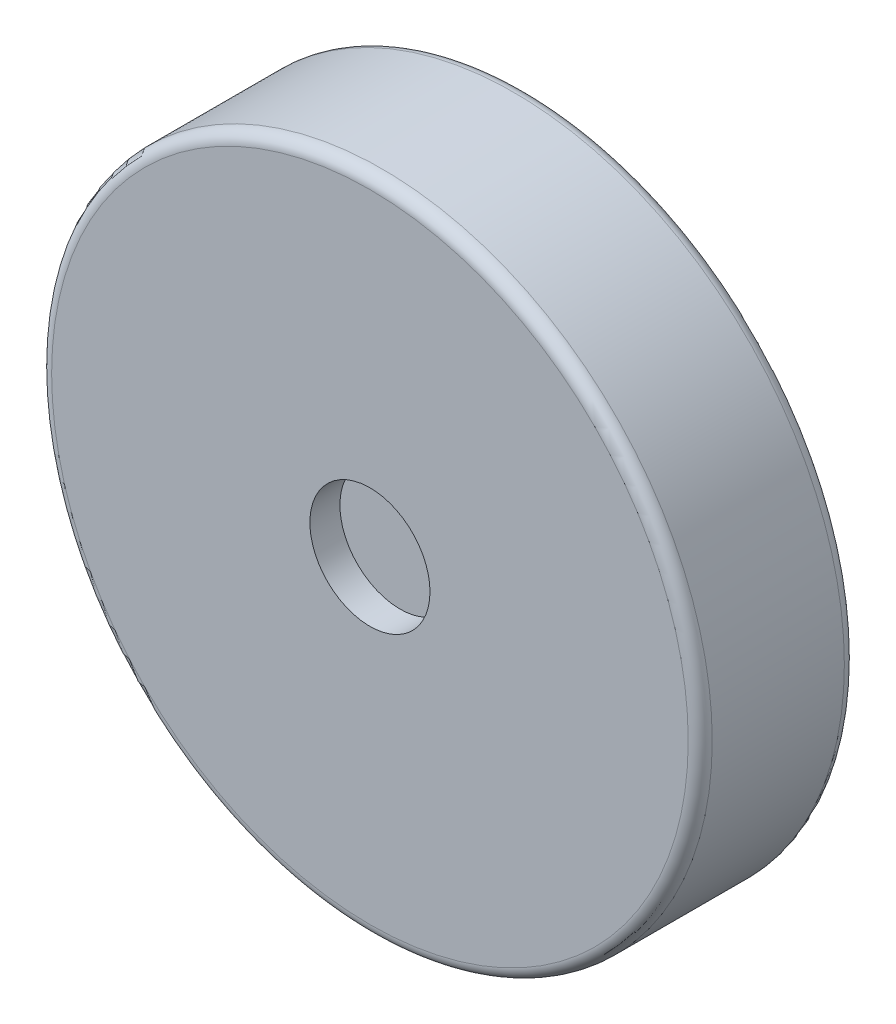
ISO-10303-21;
HEADER;
FILE_DESCRIPTION(('STEP AP214'),'2;1');
FILE_NAME('part.step','',(''),(''),'','','');
FILE_SCHEMA(('AUTOMOTIVE_DESIGN { 1 0 10303 214 1 1 1 1 }'));
ENDSEC;
DATA;
#1=APPLICATION_CONTEXT('core data for automotive mechanical design processes');
#2=APPLICATION_PROTOCOL_DEFINITION('international standard','automotive_design',2000,#1);
#3=PRODUCT_CONTEXT('',#1,'mechanical');
#4=PRODUCT('Part','Part','',(#3));
#5=PRODUCT_RELATED_PRODUCT_CATEGORY('part','',(#4));
#6=PRODUCT_DEFINITION_FORMATION('','',#4);
#7=PRODUCT_DEFINITION_CONTEXT('part definition',#1,'design');
#8=PRODUCT_DEFINITION('design','',#6,#7);
#9=PRODUCT_DEFINITION_SHAPE('','',#8);
#10=(LENGTH_UNIT() NAMED_UNIT(*) SI_UNIT(.MILLI.,.METRE.));
#11=(NAMED_UNIT(*) PLANE_ANGLE_UNIT() SI_UNIT($,.RADIAN.));
#12=(NAMED_UNIT(*) SI_UNIT($,.STERADIAN.) SOLID_ANGLE_UNIT());
#13=UNCERTAINTY_MEASURE_WITH_UNIT(LENGTH_MEASURE(1.E-05),#10,'distance_accuracy_value','');
#14=(GEOMETRIC_REPRESENTATION_CONTEXT(3) GLOBAL_UNCERTAINTY_ASSIGNED_CONTEXT((#13)) GLOBAL_UNIT_ASSIGNED_CONTEXT((#10,
#11,#12)) REPRESENTATION_CONTEXT('',''));
#15=CARTESIAN_POINT('',(0.,0.,0.));
#16=DIRECTION('',(0.,0.,1.));
#17=DIRECTION('',(1.,0.,0.));
#18=AXIS2_PLACEMENT_3D('',#15,#16,#17);
#19=CARTESIAN_POINT('',(0.,0.,26.));
#20=DIRECTION('',(0.,0.,-1.));
#21=DIRECTION('',(-1.,0.,0.));
#22=AXIS2_PLACEMENT_3D('',#19,#20,#21);
#23=CYLINDRICAL_SURFACE('',#22,55.);
#24=CARTESIAN_POINT('',(0.,0.,24.));
#25=DIRECTION('',(0.,0.,1.));
#26=DIRECTION('',(1.,0.,0.));
#27=AXIS2_PLACEMENT_3D('',#24,#25,#26);
#28=CIRCLE('',#27,55.);
#29=CARTESIAN_POINT('',(-55.,0.,24.));
#30=VERTEX_POINT('',#29);
#31=EDGE_CURVE('E43',#30,#30,#28,.F.);
#32=CARTESIAN_POINT('',(0.,0.,2.));
#33=DIRECTION('',(0.,0.,1.));
#34=DIRECTION('',(1.,0.,0.));
#35=AXIS2_PLACEMENT_3D('',#32,#33,#34);
#36=CIRCLE('',#35,55.);
#37=CARTESIAN_POINT('',(-55.,0.,1.99999999999999));
#38=VERTEX_POINT('',#37);
#39=EDGE_CURVE('E47',#38,#38,#36,.T.);
#40=CARTESIAN_POINT('',(-55.,0.,24.));
#41=CARTESIAN_POINT('',(-55.,0.,23.7708333333333));
#42=CARTESIAN_POINT('',(-55.,0.,23.5416666666667));
#43=CARTESIAN_POINT('',(-55.,0.,23.0833333333333));
#44=CARTESIAN_POINT('',(-55.,0.,22.8541666666667));
#45=CARTESIAN_POINT('',(-55.,0.,22.3958333333333));
#46=CARTESIAN_POINT('',(-55.,0.,22.1666666666667));
#47=CARTESIAN_POINT('',(-55.,0.,21.7083333333333));
#48=CARTESIAN_POINT('',(-55.,0.,21.4791666666667));
#49=CARTESIAN_POINT('',(-55.,0.,21.0208333333333));
#50=CARTESIAN_POINT('',(-55.,0.,20.7916666666667));
#51=CARTESIAN_POINT('',(-55.,0.,20.3333333333333));
#52=CARTESIAN_POINT('',(-55.,0.,20.1041666666667));
#53=CARTESIAN_POINT('',(-55.,0.,19.6458333333333));
#54=CARTESIAN_POINT('',(-55.,0.,19.4166666666667));
#55=CARTESIAN_POINT('',(-55.,0.,18.9583333333333));
#56=CARTESIAN_POINT('',(-55.,0.,18.7291666666667));
#57=CARTESIAN_POINT('',(-55.,0.,18.2708333333333));
#58=CARTESIAN_POINT('',(-55.,0.,18.0416666666667));
#59=CARTESIAN_POINT('',(-55.,0.,17.5833333333333));
#60=CARTESIAN_POINT('',(-55.,0.,17.3541666666667));
#61=CARTESIAN_POINT('',(-55.,0.,16.8958333333333));
#62=CARTESIAN_POINT('',(-55.,0.,16.6666666666667));
#63=CARTESIAN_POINT('',(-55.,0.,16.2083333333333));
#64=CARTESIAN_POINT('',(-55.,0.,15.9791666666667));
#65=CARTESIAN_POINT('',(-55.,0.,15.5208333333333));
#66=CARTESIAN_POINT('',(-55.,0.,15.2916666666667));
#67=CARTESIAN_POINT('',(-55.,0.,14.8333333333333));
#68=CARTESIAN_POINT('',(-55.,0.,14.6041666666667));
#69=CARTESIAN_POINT('',(-55.,0.,14.1458333333333));
#70=CARTESIAN_POINT('',(-55.,0.,13.9166666666667));
#71=CARTESIAN_POINT('',(-55.,0.,13.4583333333333));
#72=CARTESIAN_POINT('',(-55.,0.,13.2291666666667));
#73=CARTESIAN_POINT('',(-55.,0.,12.7708333333333));
#74=CARTESIAN_POINT('',(-55.,0.,12.5416666666667));
#75=CARTESIAN_POINT('',(-55.,0.,12.0833333333333));
#76=CARTESIAN_POINT('',(-55.,0.,11.8541666666667));
#77=CARTESIAN_POINT('',(-55.,0.,11.3958333333333));
#78=CARTESIAN_POINT('',(-55.,0.,11.1666666666667));
#79=CARTESIAN_POINT('',(-55.,0.,10.7083333333333));
#80=CARTESIAN_POINT('',(-55.,0.,10.4791666666667));
#81=CARTESIAN_POINT('',(-55.,0.,10.0208333333333));
#82=CARTESIAN_POINT('',(-55.,0.,9.79166666666667));
#83=CARTESIAN_POINT('',(-55.,0.,9.33333333333333));
#84=CARTESIAN_POINT('',(-55.,0.,9.10416666666666));
#85=CARTESIAN_POINT('',(-55.,0.,8.64583333333333));
#86=CARTESIAN_POINT('',(-55.,0.,8.41666666666666));
#87=CARTESIAN_POINT('',(-55.,0.,7.95833333333333));
#88=CARTESIAN_POINT('',(-55.,0.,7.72916666666666));
#89=CARTESIAN_POINT('',(-55.,0.,7.27083333333333));
#90=CARTESIAN_POINT('',(-55.,0.,7.04166666666666));
#91=CARTESIAN_POINT('',(-55.,0.,6.58333333333333));
#92=CARTESIAN_POINT('',(-55.,0.,6.35416666666666));
#93=CARTESIAN_POINT('',(-55.,0.,5.89583333333333));
#94=CARTESIAN_POINT('',(-55.,0.,5.66666666666666));
#95=CARTESIAN_POINT('',(-55.,0.,5.20833333333333));
#96=CARTESIAN_POINT('',(-55.,0.,4.97916666666666));
#97=CARTESIAN_POINT('',(-55.,0.,4.52083333333333));
#98=CARTESIAN_POINT('',(-55.,0.,4.29166666666666));
#99=CARTESIAN_POINT('',(-55.,0.,3.83333333333333));
#100=CARTESIAN_POINT('',(-55.,0.,3.60416666666666));
#101=CARTESIAN_POINT('',(-55.,0.,3.14583333333333));
#102=CARTESIAN_POINT('',(-55.,0.,2.91666666666666));
#103=CARTESIAN_POINT('',(-55.,0.,2.45833333333333));
#104=CARTESIAN_POINT('',(-55.,0.,2.22916666666666));
#105=CARTESIAN_POINT('',(-55.,0.,1.99999999999999));
#106=B_SPLINE_CURVE_WITH_KNOTS('',3,(#40,#41,#42,#43,#44,#45,#46,#47,#48,#49,#50,#51,#52,#53,
#54,#55,#56,#57,#58,#59,#60,#61,#62,#63,#64,#65,#66,#67,#68,#69,#70,#71,#72,#73,#74,#75,#76,#77,
#78,#79,#80,#81,#82,#83,#84,#85,#86,#87,#88,#89,#90,#91,#92,#93,#94,#95,#96,#97,#98,#99,#100,
#101,#102,#103,#104,#105),.UNSPECIFIED.,.F.,.F.,(4,2,2,2,2,2,2,2,2,2,2,2,2,2,2,2,2,2,2,2,2,2,2,
2,2,2,2,2,2,2,2,2,4),(0.,0.687499999999997,1.375,2.0625,2.75,3.4375,4.125,4.8125,5.5,6.1875,
6.875,7.5625,8.25,8.9375,9.625,10.3125,11.,11.6875,12.375,13.0625,13.75,14.4375,15.125,15.8125,
16.5,17.1875,17.875,18.5625,19.25,19.9375,20.625,21.3125,22.),.UNSPECIFIED.);
#107=EDGE_CURVE('BSEAM36',#30,#38,#106,.T.);
#108=ORIENTED_EDGE('',*,*,#31,.T.);
#109=ORIENTED_EDGE('',*,*,#39,.T.);
#110=ORIENTED_EDGE('',*,*,#107,.T.);
#111=ORIENTED_EDGE('',*,*,#107,.F.);
#112=EDGE_LOOP('',(#108,#110,#109,#111));
#113=FACE_BOUND('',#112,.T.);
#114=ADVANCED_FACE('F36',(#113),#23,.T.);
#115=CARTESIAN_POINT('',(0.,0.,26.));
#116=DIRECTION('',(0.,0.,1.));
#117=DIRECTION('',(1.,0.,0.));
#118=AXIS2_PLACEMENT_3D('',#115,#116,#117);
#119=PLANE('',#118);
#120=CARTESIAN_POINT('',(0.,0.,26.));
#121=DIRECTION('',(0.,0.,1.));
#122=DIRECTION('',(1.,0.,0.));
#123=AXIS2_PLACEMENT_3D('',#120,#121,#122);
#124=CIRCLE('',#123,10.);
#125=CARTESIAN_POINT('',(10.,0.,26.));
#126=VERTEX_POINT('',#125);
#127=EDGE_CURVE('E105',#126,#126,#124,.T.);
#128=ORIENTED_EDGE('',*,*,#127,.F.);
#129=EDGE_LOOP('',(#128));
#130=FACE_BOUND('',#129,.T.);
#131=CARTESIAN_POINT('',(0.,0.,26.));
#132=DIRECTION('',(0.,0.,1.));
#133=DIRECTION('',(1.,0.,0.));
#134=AXIS2_PLACEMENT_3D('',#131,#132,#133);
#135=CIRCLE('',#134,53.);
#136=CARTESIAN_POINT('',(53.,0.,26.));
#137=VERTEX_POINT('',#136);
#138=EDGE_CURVE('E51',#137,#137,#135,.T.);
#139=ORIENTED_EDGE('',*,*,#138,.T.);
#140=EDGE_LOOP('',(#139));
#141=FACE_BOUND('',#140,.T.);
#142=ADVANCED_FACE('F119',(#130,#141),#119,.T.);
#143=CARTESIAN_POINT('',(0.,0.,0.));
#144=DIRECTION('',(0.,0.,1.));
#145=DIRECTION('',(1.,0.,0.));
#146=AXIS2_PLACEMENT_3D('',#143,#144,#145);
#147=PLANE('',#146);
#148=CARTESIAN_POINT('',(0.,0.,0.));
#149=DIRECTION('',(0.,0.,1.));
#150=DIRECTION('',(1.,0.,0.));
#151=AXIS2_PLACEMENT_3D('',#148,#149,#150);
#152=CIRCLE('',#151,53.);
#153=CARTESIAN_POINT('',(53.,0.,0.));
#154=VERTEX_POINT('',#153);
#155=EDGE_CURVE('E10',#154,#154,#152,.F.);
#156=ORIENTED_EDGE('',*,*,#155,.T.);
#157=EDGE_LOOP('',(#156));
#158=FACE_BOUND('',#157,.T.);
#159=CARTESIAN_POINT('',(0.,-21.,0.));
#160=DIRECTION('',(0.,0.,-1.));
#161=DIRECTION('',(-1.,0.,0.));
#162=AXIS2_PLACEMENT_3D('',#159,#160,#161);
#163=CIRCLE('',#162,1.50000000000015);
#164=CARTESIAN_POINT('',(-1.50000000000014,-21.,0.));
#165=VERTEX_POINT('',#164);
#166=EDGE_CURVE('E100',#165,#165,#163,.T.);
#167=ORIENTED_EDGE('',*,*,#166,.F.);
#168=EDGE_LOOP('',(#167));
#169=FACE_BOUND('',#168,.T.);
#170=CARTESIAN_POINT('',(14.8492424049175,-14.8492424049175,0.));
#171=DIRECTION('',(0.,0.,-1.));
#172=DIRECTION('',(-1.,0.,0.));
#173=AXIS2_PLACEMENT_3D('',#170,#171,#172);
#174=CIRCLE('',#173,1.50000000000011);
#175=CARTESIAN_POINT('',(13.3492424049174,-14.8492424049175,0.));
#176=VERTEX_POINT('',#175);
#177=EDGE_CURVE('E94',#176,#176,#174,.T.);
#178=ORIENTED_EDGE('',*,*,#177,.F.);
#179=EDGE_LOOP('',(#178));
#180=FACE_BOUND('',#179,.T.);
#181=CARTESIAN_POINT('',(21.,0.,0.));
#182=DIRECTION('',(0.,0.,-1.));
#183=DIRECTION('',(-1.,0.,0.));
#184=AXIS2_PLACEMENT_3D('',#181,#182,#183);
#185=CIRCLE('',#184,1.50000000000007);
#186=CARTESIAN_POINT('',(19.4999999999999,0.,0.));
#187=VERTEX_POINT('',#186);
#188=EDGE_CURVE('E88',#187,#187,#185,.T.);
#189=ORIENTED_EDGE('',*,*,#188,.F.);
#190=EDGE_LOOP('',(#189));
#191=FACE_BOUND('',#190,.T.);
#192=CARTESIAN_POINT('',(14.8492424049175,14.8492424049175,0.));
#193=DIRECTION('',(0.,0.,-1.));
#194=DIRECTION('',(-1.,0.,0.));
#195=AXIS2_PLACEMENT_3D('',#192,#193,#194);
#196=CIRCLE('',#195,1.5);
#197=CARTESIAN_POINT('',(13.3492424049175,14.8492424049175,0.));
#198=VERTEX_POINT('',#197);
#199=EDGE_CURVE('E82',#198,#198,#196,.T.);
#200=ORIENTED_EDGE('',*,*,#199,.F.);
#201=EDGE_LOOP('',(#200));
#202=FACE_BOUND('',#201,.T.);
#203=CARTESIAN_POINT('',(0.,21.,0.));
#204=DIRECTION('',(0.,0.,-1.));
#205=DIRECTION('',(-1.,0.,0.));
#206=AXIS2_PLACEMENT_3D('',#203,#204,#205);
#207=CIRCLE('',#206,1.5);
#208=CARTESIAN_POINT('',(-1.5,21.,0.));
#209=VERTEX_POINT('',#208);
#210=EDGE_CURVE('E76',#209,#209,#207,.T.);
#211=ORIENTED_EDGE('',*,*,#210,.F.);
#212=EDGE_LOOP('',(#211));
#213=FACE_BOUND('',#212,.T.);
#214=CARTESIAN_POINT('',(-14.8492424049175,14.8492424049175,0.));
#215=DIRECTION('',(0.,0.,-1.));
#216=DIRECTION('',(-1.,0.,0.));
#217=AXIS2_PLACEMENT_3D('',#214,#215,#216);
#218=CIRCLE('',#217,1.50000000000025);
#219=CARTESIAN_POINT('',(-16.3492424049178,14.8492424049175,0.));
#220=VERTEX_POINT('',#219);
#221=EDGE_CURVE('E70',#220,#220,#218,.T.);
#222=ORIENTED_EDGE('',*,*,#221,.F.);
#223=EDGE_LOOP('',(#222));
#224=FACE_BOUND('',#223,.T.);
#225=CARTESIAN_POINT('',(-21.,0.,0.));
#226=DIRECTION('',(0.,0.,-1.));
#227=DIRECTION('',(-1.,0.,0.));
#228=AXIS2_PLACEMENT_3D('',#225,#226,#227);
#229=CIRCLE('',#228,1.50000000000022);
#230=CARTESIAN_POINT('',(-22.5000000000002,0.,0.));
#231=VERTEX_POINT('',#230);
#232=EDGE_CURVE('E64',#231,#231,#229,.T.);
#233=ORIENTED_EDGE('',*,*,#232,.F.);
#234=EDGE_LOOP('',(#233));
#235=FACE_BOUND('',#234,.T.);
#236=CARTESIAN_POINT('',(-14.8492424049175,-14.8492424049175,0.));
#237=DIRECTION('',(0.,0.,-1.));
#238=DIRECTION('',(-1.,0.,0.));
#239=AXIS2_PLACEMENT_3D('',#236,#237,#238);
#240=CIRCLE('',#239,1.50000000000018);
#241=CARTESIAN_POINT('',(-16.3492424049177,-14.8492424049175,0.));
#242=VERTEX_POINT('',#241);
#243=EDGE_CURVE('E57',#242,#242,#240,.T.);
#244=ORIENTED_EDGE('',*,*,#243,.F.);
#245=EDGE_LOOP('',(#244));
#246=FACE_BOUND('',#245,.T.);
#247=ADVANCED_FACE('F122',(#158,#169,#180,#191,#202,#213,#224,#235,#246),#147,.F.);
#248=CARTESIAN_POINT('',(-14.8492424049175,-14.8492424049175,3.));
#249=DIRECTION('',(0.,0.,-1.));
#250=DIRECTION('',(-1.,0.,0.));
#251=AXIS2_PLACEMENT_3D('',#248,#249,#250);
#252=CYLINDRICAL_SURFACE('',#251,1.50000000000018);
#253=CARTESIAN_POINT('',(-14.8492424049175,-14.8492424049175,3.));
#254=DIRECTION('',(0.,0.,-1.));
#255=DIRECTION('',(-1.,0.,0.));
#256=AXIS2_PLACEMENT_3D('',#253,#254,#255);
#257=CIRCLE('',#256,1.50000000000018);
#258=CARTESIAN_POINT('',(-16.3492424049177,-14.8492424049175,3.));
#259=VERTEX_POINT('',#258);
#260=EDGE_CURVE('E60',#259,#259,#257,.T.);
#261=ORIENTED_EDGE('',*,*,#260,.F.);
#262=EDGE_LOOP('',(#261));
#263=FACE_BOUND('',#262,.T.);
#264=ORIENTED_EDGE('',*,*,#243,.T.);
#265=EDGE_LOOP('',(#264));
#266=FACE_BOUND('',#265,.T.);
#267=ADVANCED_FACE('F145',(#263,#266),#252,.F.);
#268=CARTESIAN_POINT('',(-14.8492424049175,-14.8492424049175,3.));
#269=DIRECTION('',(0.,0.,-1.));
#270=DIRECTION('',(-1.,0.,0.));
#271=AXIS2_PLACEMENT_3D('',#268,#269,#270);
#272=PLANE('',#271);
#273=ORIENTED_EDGE('',*,*,#260,.T.);
#274=EDGE_LOOP('',(#273));
#275=FACE_BOUND('',#274,.T.);
#276=ADVANCED_FACE('F149',(#275),#272,.T.);
#277=CARTESIAN_POINT('',(-21.,0.,3.));
#278=DIRECTION('',(0.,0.,-1.));
#279=DIRECTION('',(-1.,0.,0.));
#280=AXIS2_PLACEMENT_3D('',#277,#278,#279);
#281=CYLINDRICAL_SURFACE('',#280,1.50000000000022);
#282=CARTESIAN_POINT('',(-21.,0.,3.));
#283=DIRECTION('',(0.,0.,-1.));
#284=DIRECTION('',(-1.,0.,0.));
#285=AXIS2_PLACEMENT_3D('',#282,#283,#284);
#286=CIRCLE('',#285,1.50000000000022);
#287=CARTESIAN_POINT('',(-22.5000000000002,0.,3.));
#288=VERTEX_POINT('',#287);
#289=EDGE_CURVE('E67',#288,#288,#286,.T.);
#290=ORIENTED_EDGE('',*,*,#289,.F.);
#291=EDGE_LOOP('',(#290));
#292=FACE_BOUND('',#291,.T.);
#293=ORIENTED_EDGE('',*,*,#232,.T.);
#294=EDGE_LOOP('',(#293));
#295=FACE_BOUND('',#294,.T.);
#296=ADVANCED_FACE('F153',(#292,#295),#281,.F.);
#297=CARTESIAN_POINT('',(-21.,0.,3.));
#298=DIRECTION('',(0.,0.,-1.));
#299=DIRECTION('',(-1.,0.,0.));
#300=AXIS2_PLACEMENT_3D('',#297,#298,#299);
#301=PLANE('',#300);
#302=ORIENTED_EDGE('',*,*,#289,.T.);
#303=EDGE_LOOP('',(#302));
#304=FACE_BOUND('',#303,.T.);
#305=ADVANCED_FACE('F157',(#304),#301,.T.);
#306=CARTESIAN_POINT('',(-14.8492424049175,14.8492424049175,3.));
#307=DIRECTION('',(0.,0.,-1.));
#308=DIRECTION('',(-1.,0.,0.));
#309=AXIS2_PLACEMENT_3D('',#306,#307,#308);
#310=CYLINDRICAL_SURFACE('',#309,1.50000000000025);
#311=CARTESIAN_POINT('',(-14.8492424049175,14.8492424049175,3.));
#312=DIRECTION('',(0.,0.,-1.));
#313=DIRECTION('',(-1.,0.,0.));
#314=AXIS2_PLACEMENT_3D('',#311,#312,#313);
#315=CIRCLE('',#314,1.50000000000025);
#316=CARTESIAN_POINT('',(-16.3492424049178,14.8492424049175,3.));
#317=VERTEX_POINT('',#316);
#318=EDGE_CURVE('E73',#317,#317,#315,.T.);
#319=ORIENTED_EDGE('',*,*,#318,.F.);
#320=EDGE_LOOP('',(#319));
#321=FACE_BOUND('',#320,.T.);
#322=ORIENTED_EDGE('',*,*,#221,.T.);
#323=EDGE_LOOP('',(#322));
#324=FACE_BOUND('',#323,.T.);
#325=ADVANCED_FACE('F161',(#321,#324),#310,.F.);
#326=CARTESIAN_POINT('',(-14.8492424049175,14.8492424049175,3.));
#327=DIRECTION('',(0.,0.,-1.));
#328=DIRECTION('',(-1.,0.,0.));
#329=AXIS2_PLACEMENT_3D('',#326,#327,#328);
#330=PLANE('',#329);
#331=ORIENTED_EDGE('',*,*,#318,.T.);
#332=EDGE_LOOP('',(#331));
#333=FACE_BOUND('',#332,.T.);
#334=ADVANCED_FACE('F165',(#333),#330,.T.);
#335=CARTESIAN_POINT('',(0.,21.,3.));
#336=DIRECTION('',(0.,0.,-1.));
#337=DIRECTION('',(-1.,0.,0.));
#338=AXIS2_PLACEMENT_3D('',#335,#336,#337);
#339=CYLINDRICAL_SURFACE('',#338,1.5);
#340=CARTESIAN_POINT('',(0.,21.,3.));
#341=DIRECTION('',(0.,0.,-1.));
#342=DIRECTION('',(-1.,0.,0.));
#343=AXIS2_PLACEMENT_3D('',#340,#341,#342);
#344=CIRCLE('',#343,1.5);
#345=CARTESIAN_POINT('',(-1.5,21.,3.));
#346=VERTEX_POINT('',#345);
#347=EDGE_CURVE('E79',#346,#346,#344,.T.);
#348=ORIENTED_EDGE('',*,*,#347,.F.);
#349=EDGE_LOOP('',(#348));
#350=FACE_BOUND('',#349,.T.);
#351=ORIENTED_EDGE('',*,*,#210,.T.);
#352=EDGE_LOOP('',(#351));
#353=FACE_BOUND('',#352,.T.);
#354=ADVANCED_FACE('F169',(#350,#353),#339,.F.);
#355=CARTESIAN_POINT('',(0.,21.,3.));
#356=DIRECTION('',(0.,0.,-1.));
#357=DIRECTION('',(-1.,0.,0.));
#358=AXIS2_PLACEMENT_3D('',#355,#356,#357);
#359=PLANE('',#358);
#360=ORIENTED_EDGE('',*,*,#347,.T.);
#361=EDGE_LOOP('',(#360));
#362=FACE_BOUND('',#361,.T.);
#363=ADVANCED_FACE('F173',(#362),#359,.T.);
#364=CARTESIAN_POINT('',(14.8492424049175,14.8492424049175,3.));
#365=DIRECTION('',(0.,0.,-1.));
#366=DIRECTION('',(-1.,0.,0.));
#367=AXIS2_PLACEMENT_3D('',#364,#365,#366);
#368=CYLINDRICAL_SURFACE('',#367,1.5);
#369=CARTESIAN_POINT('',(14.8492424049175,14.8492424049175,3.));
#370=DIRECTION('',(0.,0.,-1.));
#371=DIRECTION('',(-1.,0.,0.));
#372=AXIS2_PLACEMENT_3D('',#369,#370,#371);
#373=CIRCLE('',#372,1.5);
#374=CARTESIAN_POINT('',(13.3492424049175,14.8492424049175,3.));
#375=VERTEX_POINT('',#374);
#376=EDGE_CURVE('E85',#375,#375,#373,.T.);
#377=ORIENTED_EDGE('',*,*,#376,.F.);
#378=EDGE_LOOP('',(#377));
#379=FACE_BOUND('',#378,.T.);
#380=ORIENTED_EDGE('',*,*,#199,.T.);
#381=EDGE_LOOP('',(#380));
#382=FACE_BOUND('',#381,.T.);
#383=ADVANCED_FACE('F177',(#379,#382),#368,.F.);
#384=CARTESIAN_POINT('',(14.8492424049175,14.8492424049175,3.));
#385=DIRECTION('',(0.,0.,-1.));
#386=DIRECTION('',(-1.,0.,0.));
#387=AXIS2_PLACEMENT_3D('',#384,#385,#386);
#388=PLANE('',#387);
#389=ORIENTED_EDGE('',*,*,#376,.T.);
#390=EDGE_LOOP('',(#389));
#391=FACE_BOUND('',#390,.T.);
#392=ADVANCED_FACE('F181',(#391),#388,.T.);
#393=CARTESIAN_POINT('',(21.,0.,3.));
#394=DIRECTION('',(0.,0.,-1.));
#395=DIRECTION('',(-1.,0.,0.));
#396=AXIS2_PLACEMENT_3D('',#393,#394,#395);
#397=CYLINDRICAL_SURFACE('',#396,1.50000000000007);
#398=CARTESIAN_POINT('',(21.,0.,3.));
#399=DIRECTION('',(0.,0.,-1.));
#400=DIRECTION('',(-1.,0.,0.));
#401=AXIS2_PLACEMENT_3D('',#398,#399,#400);
#402=CIRCLE('',#401,1.50000000000007);
#403=CARTESIAN_POINT('',(19.4999999999999,0.,3.));
#404=VERTEX_POINT('',#403);
#405=EDGE_CURVE('E91',#404,#404,#402,.T.);
#406=ORIENTED_EDGE('',*,*,#405,.F.);
#407=EDGE_LOOP('',(#406));
#408=FACE_BOUND('',#407,.T.);
#409=ORIENTED_EDGE('',*,*,#188,.T.);
#410=EDGE_LOOP('',(#409));
#411=FACE_BOUND('',#410,.T.);
#412=ADVANCED_FACE('F185',(#408,#411),#397,.F.);
#413=CARTESIAN_POINT('',(21.,0.,3.));
#414=DIRECTION('',(0.,0.,-1.));
#415=DIRECTION('',(-1.,0.,0.));
#416=AXIS2_PLACEMENT_3D('',#413,#414,#415);
#417=PLANE('',#416);
#418=ORIENTED_EDGE('',*,*,#405,.T.);
#419=EDGE_LOOP('',(#418));
#420=FACE_BOUND('',#419,.T.);
#421=ADVANCED_FACE('F189',(#420),#417,.T.);
#422=CARTESIAN_POINT('',(14.8492424049175,-14.8492424049175,3.));
#423=DIRECTION('',(0.,0.,-1.));
#424=DIRECTION('',(-1.,0.,0.));
#425=AXIS2_PLACEMENT_3D('',#422,#423,#424);
#426=CYLINDRICAL_SURFACE('',#425,1.50000000000011);
#427=CARTESIAN_POINT('',(14.8492424049175,-14.8492424049175,3.));
#428=DIRECTION('',(0.,0.,-1.));
#429=DIRECTION('',(-1.,0.,0.));
#430=AXIS2_PLACEMENT_3D('',#427,#428,#429);
#431=CIRCLE('',#430,1.50000000000011);
#432=CARTESIAN_POINT('',(13.3492424049174,-14.8492424049175,3.));
#433=VERTEX_POINT('',#432);
#434=EDGE_CURVE('E97',#433,#433,#431,.T.);
#435=ORIENTED_EDGE('',*,*,#434,.F.);
#436=EDGE_LOOP('',(#435));
#437=FACE_BOUND('',#436,.T.);
#438=ORIENTED_EDGE('',*,*,#177,.T.);
#439=EDGE_LOOP('',(#438));
#440=FACE_BOUND('',#439,.T.);
#441=ADVANCED_FACE('F193',(#437,#440),#426,.F.);
#442=CARTESIAN_POINT('',(14.8492424049175,-14.8492424049175,3.));
#443=DIRECTION('',(0.,0.,-1.));
#444=DIRECTION('',(-1.,0.,0.));
#445=AXIS2_PLACEMENT_3D('',#442,#443,#444);
#446=PLANE('',#445);
#447=ORIENTED_EDGE('',*,*,#434,.T.);
#448=EDGE_LOOP('',(#447));
#449=FACE_BOUND('',#448,.T.);
#450=ADVANCED_FACE('F197',(#449),#446,.T.);
#451=CARTESIAN_POINT('',(0.,-21.,3.));
#452=DIRECTION('',(0.,0.,-1.));
#453=DIRECTION('',(-1.,0.,0.));
#454=AXIS2_PLACEMENT_3D('',#451,#452,#453);
#455=CYLINDRICAL_SURFACE('',#454,1.50000000000015);
#456=CARTESIAN_POINT('',(0.,-21.,3.));
#457=DIRECTION('',(0.,0.,-1.));
#458=DIRECTION('',(-1.,0.,0.));
#459=AXIS2_PLACEMENT_3D('',#456,#457,#458);
#460=CIRCLE('',#459,1.50000000000015);
#461=CARTESIAN_POINT('',(-1.50000000000014,-21.,3.));
#462=VERTEX_POINT('',#461);
#463=EDGE_CURVE('E56',#462,#462,#460,.T.);
#464=ORIENTED_EDGE('',*,*,#463,.F.);
#465=EDGE_LOOP('',(#464));
#466=FACE_BOUND('',#465,.T.);
#467=ORIENTED_EDGE('',*,*,#166,.T.);
#468=EDGE_LOOP('',(#467));
#469=FACE_BOUND('',#468,.T.);
#470=ADVANCED_FACE('F135',(#466,#469),#455,.F.);
#471=CARTESIAN_POINT('',(0.,-21.,3.));
#472=DIRECTION('',(0.,0.,-1.));
#473=DIRECTION('',(-1.,0.,0.));
#474=AXIS2_PLACEMENT_3D('',#471,#472,#473);
#475=PLANE('',#474);
#476=ORIENTED_EDGE('',*,*,#463,.T.);
#477=EDGE_LOOP('',(#476));
#478=FACE_BOUND('',#477,.T.);
#479=ADVANCED_FACE('F128',(#478),#475,.T.);
#480=CARTESIAN_POINT('',(0.,0.,24.));
#481=DIRECTION('',(0.,0.,1.));
#482=DIRECTION('',(1.,0.,0.));
#483=AXIS2_PLACEMENT_3D('',#480,#481,#482);
#484=TOROIDAL_SURFACE('',#483,53.,2.);
#485=ORIENTED_EDGE('',*,*,#31,.F.);
#486=EDGE_LOOP('',(#485));
#487=FACE_BOUND('',#486,.T.);
#488=ORIENTED_EDGE('',*,*,#138,.F.);
#489=EDGE_LOOP('',(#488));
#490=FACE_BOUND('',#489,.T.);
#491=ADVANCED_FACE('F126',(#487,#490),#484,.T.);
#492=CARTESIAN_POINT('',(0.,0.,2.));
#493=DIRECTION('',(0.,0.,1.));
#494=DIRECTION('',(1.,0.,0.));
#495=AXIS2_PLACEMENT_3D('',#492,#493,#494);
#496=TOROIDAL_SURFACE('',#495,53.,2.);
#497=ORIENTED_EDGE('',*,*,#155,.F.);
#498=EDGE_LOOP('',(#497));
#499=FACE_BOUND('',#498,.T.);
#500=ORIENTED_EDGE('',*,*,#39,.F.);
#501=EDGE_LOOP('',(#500));
#502=FACE_BOUND('',#501,.T.);
#503=ADVANCED_FACE('F38',(#499,#502),#496,.T.);
#504=CARTESIAN_POINT('',(0.,0.,21.));
#505=DIRECTION('',(0.,0.,1.));
#506=DIRECTION('',(1.,0.,0.));
#507=AXIS2_PLACEMENT_3D('',#504,#505,#506);
#508=CYLINDRICAL_SURFACE('',#507,10.);
#509=CARTESIAN_POINT('',(0.,0.,21.));
#510=DIRECTION('',(0.,0.,1.));
#511=DIRECTION('',(1.,0.,0.));
#512=AXIS2_PLACEMENT_3D('',#509,#510,#511);
#513=CIRCLE('',#512,10.);
#514=CARTESIAN_POINT('',(10.,0.,21.));
#515=VERTEX_POINT('',#514);
#516=EDGE_CURVE('E61',#515,#515,#513,.T.);
#517=ORIENTED_EDGE('',*,*,#516,.F.);
#518=EDGE_LOOP('',(#517));
#519=FACE_BOUND('',#518,.T.);
#520=ORIENTED_EDGE('',*,*,#127,.T.);
#521=EDGE_LOOP('',(#520));
#522=FACE_BOUND('',#521,.T.);
#523=ADVANCED_FACE('F113',(#519,#522),#508,.F.);
#524=CARTESIAN_POINT('',(0.,0.,21.));
#525=DIRECTION('',(0.,0.,1.));
#526=DIRECTION('',(1.,0.,0.));
#527=AXIS2_PLACEMENT_3D('',#524,#525,#526);
#528=PLANE('',#527);
#529=ORIENTED_EDGE('',*,*,#516,.T.);
#530=EDGE_LOOP('',(#529));
#531=FACE_BOUND('',#530,.T.);
#532=ADVANCED_FACE('F111',(#531),#528,.T.);
#533=CLOSED_SHELL('',(#114,#142,#247,#267,#276,#296,#305,#325,#334,#354,#363,#383,#392,#412,
#421,#441,#450,#470,#479,#491,#503,#523,#532));
#534=MANIFOLD_SOLID_BREP('B2',#533);
#535=ADVANCED_BREP_SHAPE_REPRESENTATION('',(#18,#534),#14);
#536=SHAPE_DEFINITION_REPRESENTATION(#9,#535);
ENDSEC;
END-ISO-10303-21;
